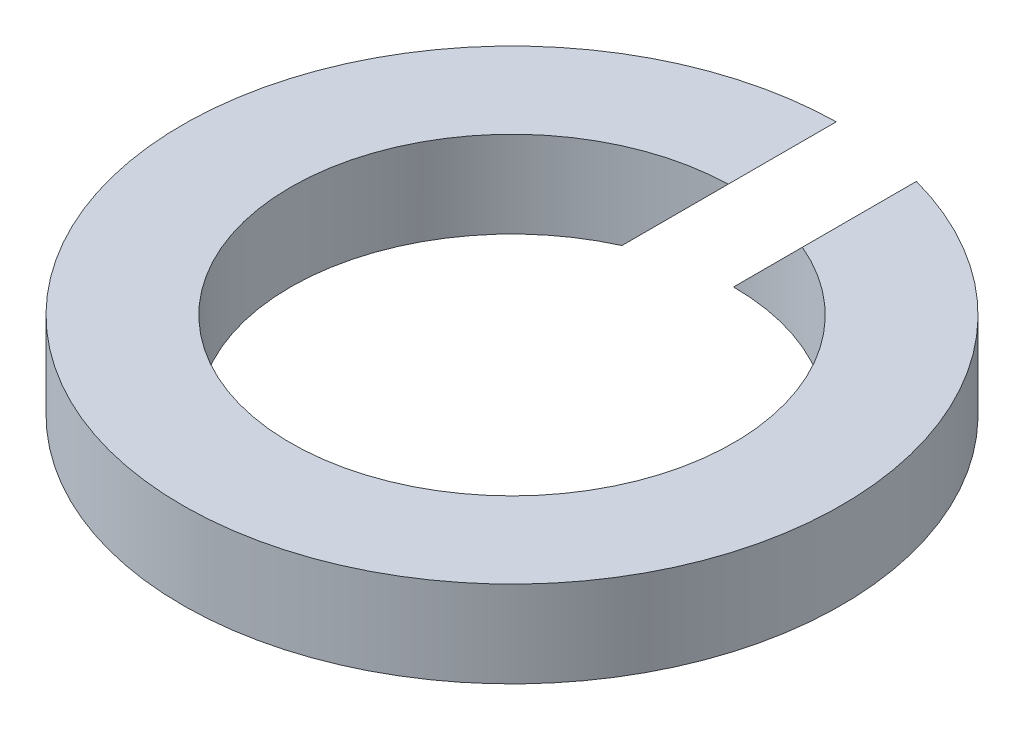
ISO-10303-21;
HEADER;
FILE_DESCRIPTION(('STEP AP214'),'2;1');
FILE_NAME('part.step','',(''),(''),'','','');
FILE_SCHEMA(('AUTOMOTIVE_DESIGN { 1 0 10303 214 1 1 1 1 }'));
ENDSEC;
DATA;
#1=APPLICATION_CONTEXT('core data for automotive mechanical design processes');
#2=APPLICATION_PROTOCOL_DEFINITION('international standard','automotive_design',2000,#1);
#3=PRODUCT_CONTEXT('',#1,'mechanical');
#4=PRODUCT('Part','Part','',(#3));
#5=PRODUCT_RELATED_PRODUCT_CATEGORY('part','',(#4));
#6=PRODUCT_DEFINITION_FORMATION('','',#4);
#7=PRODUCT_DEFINITION_CONTEXT('part definition',#1,'design');
#8=PRODUCT_DEFINITION('design','',#6,#7);
#9=PRODUCT_DEFINITION_SHAPE('','',#8);
#10=(LENGTH_UNIT() NAMED_UNIT(*) SI_UNIT(.MILLI.,.METRE.));
#11=(NAMED_UNIT(*) PLANE_ANGLE_UNIT() SI_UNIT($,.RADIAN.));
#12=(NAMED_UNIT(*) SI_UNIT($,.STERADIAN.) SOLID_ANGLE_UNIT());
#13=UNCERTAINTY_MEASURE_WITH_UNIT(LENGTH_MEASURE(1.E-05),#10,'distance_accuracy_value','');
#14=(GEOMETRIC_REPRESENTATION_CONTEXT(3) GLOBAL_UNCERTAINTY_ASSIGNED_CONTEXT((#13)) GLOBAL_UNIT_ASSIGNED_CONTEXT((#10,
#11,#12)) REPRESENTATION_CONTEXT('',''));
#15=CARTESIAN_POINT('',(0.,0.,0.));
#16=DIRECTION('',(0.,0.,1.));
#17=DIRECTION('',(1.,0.,0.));
#18=AXIS2_PLACEMENT_3D('',#15,#16,#17);
#19=CARTESIAN_POINT('',(0.,1.6,0.));
#20=DIRECTION('',(0.,1.,0.));
#21=DIRECTION('',(0.,0.,1.));
#22=AXIS2_PLACEMENT_3D('',#19,#20,#21);
#23=PLANE('',#22);
#24=DIRECTION('',(0.,0.,1.));
#25=VECTOR('',#24,1.);
#26=CARTESIAN_POINT('',(-0.0970562748477116,1.6,-6.1));
#27=LINE('',#26,#25);
#28=CARTESIAN_POINT('',(-0.0970562748477116,1.6,-6.09922782649678));
#29=VERTEX_POINT('',#28);
#30=CARTESIAN_POINT('',(-0.0970562748477116,1.6,-4.09885106822786));
#31=VERTEX_POINT('',#30);
#32=EDGE_CURVE('E60',#29,#31,#27,.T.);
#33=ORIENTED_EDGE('',*,*,#32,.F.);
#34=CARTESIAN_POINT('',(0.,1.6,0.));
#35=DIRECTION('',(0.,1.,0.));
#36=DIRECTION('',(0.,0.,1.));
#37=AXIS2_PLACEMENT_3D('',#34,#35,#36);
#38=CIRCLE('',#37,6.1);
#39=CARTESIAN_POINT('',(1.60000000000001,1.6,-5.88642506110457));
#40=VERTEX_POINT('',#39);
#41=EDGE_CURVE('E97',#29,#40,#38,.T.);
#42=ORIENTED_EDGE('',*,*,#41,.T.);
#43=DIRECTION('',(0.,0.,1.));
#44=VECTOR('',#43,1.);
#45=CARTESIAN_POINT('',(1.60000000000001,1.6,-6.1));
#46=LINE('',#45,#44);
#47=CARTESIAN_POINT('',(1.60000000000001,1.6,-3.77491721763537));
#48=VERTEX_POINT('',#47);
#49=EDGE_CURVE('E79',#40,#48,#46,.T.);
#50=ORIENTED_EDGE('',*,*,#49,.T.);
#51=CARTESIAN_POINT('',(0.,1.6,0.));
#52=DIRECTION('',(0.,1.,0.));
#53=DIRECTION('',(0.,0.,1.));
#54=AXIS2_PLACEMENT_3D('',#51,#52,#53);
#55=CIRCLE('',#54,4.1);
#56=EDGE_CURVE('E98',#31,#48,#55,.T.);
#57=ORIENTED_EDGE('',*,*,#56,.F.);
#58=EDGE_LOOP('',(#33,#42,#50,#57));
#59=FACE_BOUND('',#58,.T.);
#60=ADVANCED_FACE('F38',(#59),#23,.T.);
#61=CARTESIAN_POINT('',(0.,0.,0.));
#62=DIRECTION('',(0.,1.,0.));
#63=DIRECTION('',(0.,0.,1.));
#64=AXIS2_PLACEMENT_3D('',#61,#62,#63);
#65=PLANE('',#64);
#66=CARTESIAN_POINT('',(0.,0.,0.));
#67=DIRECTION('',(0.,1.,0.));
#68=DIRECTION('',(0.,0.,1.));
#69=AXIS2_PLACEMENT_3D('',#66,#67,#68);
#70=CIRCLE('',#69,6.1);
#71=CARTESIAN_POINT('',(-1.69705627484772,0.,-5.8591808301161));
#72=VERTEX_POINT('',#71);
#73=CARTESIAN_POINT('',(0.,0.,-6.1));
#74=VERTEX_POINT('',#73);
#75=EDGE_CURVE('E92',#72,#74,#70,.T.);
#76=ORIENTED_EDGE('',*,*,#75,.F.);
#77=DIRECTION('',(0.,0.,1.));
#78=VECTOR('',#77,1.);
#79=CARTESIAN_POINT('',(-1.69705627484772,0.,-6.1));
#80=LINE('',#79,#78);
#81=CARTESIAN_POINT('',(-1.69705627484772,0.,-3.7322915213043));
#82=VERTEX_POINT('',#81);
#83=EDGE_CURVE('E85',#72,#82,#80,.T.);
#84=ORIENTED_EDGE('',*,*,#83,.T.);
#85=CARTESIAN_POINT('',(0.,0.,0.));
#86=DIRECTION('',(0.,1.,0.));
#87=DIRECTION('',(0.,0.,1.));
#88=AXIS2_PLACEMENT_3D('',#85,#86,#87);
#89=CIRCLE('',#88,4.1);
#90=CARTESIAN_POINT('',(0.,0.,-4.1));
#91=VERTEX_POINT('',#90);
#92=EDGE_CURVE('E94',#82,#91,#89,.T.);
#93=ORIENTED_EDGE('',*,*,#92,.T.);
#94=DIRECTION('',(0.,0.,1.));
#95=VECTOR('',#94,1.);
#96=CARTESIAN_POINT('',(0.,0.,-6.1));
#97=LINE('',#96,#95);
#98=EDGE_CURVE('E53',#74,#91,#97,.T.);
#99=ORIENTED_EDGE('',*,*,#98,.F.);
#100=EDGE_LOOP('',(#76,#84,#93,#99));
#101=FACE_BOUND('',#100,.T.);
#102=ADVANCED_FACE('F90',(#101),#65,.F.);
#103=CARTESIAN_POINT('',(0.,1.6,0.));
#104=DIRECTION('',(0.,-1.,0.));
#105=DIRECTION('',(0.,0.,-1.));
#106=AXIS2_PLACEMENT_3D('',#103,#104,#105);
#107=CYLINDRICAL_SURFACE('',#106,6.1);
#108=ORIENTED_EDGE('',*,*,#41,.F.);
#109=CARTESIAN_POINT('',(0.,1.69705627484771,0.));
#110=DIRECTION('',(-0.707106781186546,0.707106781186549,0.));
#111=DIRECTION('',(-0.707106781186549,-0.707106781186546,0.));
#112=AXIS2_PLACEMENT_3D('',#109,#110,#111);
#113=ELLIPSE('',#112,8.62670273047586,6.1);
#114=EDGE_CURVE('E84',#29,#72,#113,.T.);
#115=ORIENTED_EDGE('',*,*,#114,.T.);
#116=ORIENTED_EDGE('',*,*,#75,.T.);
#117=CARTESIAN_POINT('',(0.,0.,0.));
#118=DIRECTION('',(0.707106781186546,-0.707106781186549,0.));
#119=DIRECTION('',(-0.707106781186549,-0.707106781186546,0.));
#120=AXIS2_PLACEMENT_3D('',#117,#118,#119);
#121=ELLIPSE('',#120,8.62670273047586,6.1);
#122=EDGE_CURVE('E76',#74,#40,#121,.T.);
#123=ORIENTED_EDGE('',*,*,#122,.T.);
#124=EDGE_LOOP('',(#108,#115,#116,#123));
#125=FACE_BOUND('',#124,.T.);
#126=ADVANCED_FACE('F40',(#125),#107,.T.);
#127=CARTESIAN_POINT('',(0.,1.6,0.));
#128=DIRECTION('',(0.,-1.,0.));
#129=DIRECTION('',(0.,0.,-1.));
#130=AXIS2_PLACEMENT_3D('',#127,#128,#129);
#131=CYLINDRICAL_SURFACE('',#130,4.1);
#132=CARTESIAN_POINT('',(0.,1.69705627484771,0.));
#133=DIRECTION('',(-0.707106781186546,0.707106781186549,0.));
#134=DIRECTION('',(-0.707106781186549,-0.707106781186546,0.));
#135=AXIS2_PLACEMENT_3D('',#132,#133,#134);
#136=ELLIPSE('',#135,5.79827560572968,4.1);
#137=EDGE_CURVE('E11',#31,#82,#136,.T.);
#138=ORIENTED_EDGE('',*,*,#137,.F.);
#139=ORIENTED_EDGE('',*,*,#56,.T.);
#140=CARTESIAN_POINT('',(0.,0.,0.));
#141=DIRECTION('',(0.707106781186546,-0.707106781186549,0.));
#142=DIRECTION('',(-0.707106781186549,-0.707106781186546,0.));
#143=AXIS2_PLACEMENT_3D('',#140,#141,#142);
#144=ELLIPSE('',#143,5.79827560572968,4.1);
#145=EDGE_CURVE('E46',#91,#48,#144,.T.);
#146=ORIENTED_EDGE('',*,*,#145,.F.);
#147=ORIENTED_EDGE('',*,*,#92,.F.);
#148=EDGE_LOOP('',(#138,#139,#146,#147));
#149=FACE_BOUND('',#148,.T.);
#150=ADVANCED_FACE('F108',(#149),#131,.F.);
#151=CARTESIAN_POINT('',(0.,0.,-6.1));
#152=DIRECTION('',(0.707106781186546,-0.707106781186549,0.));
#153=DIRECTION('',(0.707106781186549,0.707106781186546,0.));
#154=AXIS2_PLACEMENT_3D('',#151,#152,#153);
#155=PLANE('',#154);
#156=ORIENTED_EDGE('',*,*,#98,.T.);
#157=ORIENTED_EDGE('',*,*,#145,.T.);
#158=ORIENTED_EDGE('',*,*,#49,.F.);
#159=ORIENTED_EDGE('',*,*,#122,.F.);
#160=EDGE_LOOP('',(#156,#157,#158,#159));
#161=FACE_BOUND('',#160,.T.);
#162=ADVANCED_FACE('F77',(#161),#155,.F.);
#163=CARTESIAN_POINT('',(-0.0970562748477116,1.6,-6.1));
#164=DIRECTION('',(-0.707106781186546,0.707106781186549,0.));
#165=DIRECTION('',(-0.707106781186549,-0.707106781186546,0.));
#166=AXIS2_PLACEMENT_3D('',#163,#164,#165);
#167=PLANE('',#166);
#168=ORIENTED_EDGE('',*,*,#32,.T.);
#169=ORIENTED_EDGE('',*,*,#137,.T.);
#170=ORIENTED_EDGE('',*,*,#83,.F.);
#171=ORIENTED_EDGE('',*,*,#114,.F.);
#172=EDGE_LOOP('',(#168,#169,#170,#171));
#173=FACE_BOUND('',#172,.T.);
#174=ADVANCED_FACE('F109',(#173),#167,.F.);
#175=CLOSED_SHELL('',(#60,#102,#126,#150,#162,#174));
#176=MANIFOLD_SOLID_BREP('B2',#175);
#177=ADVANCED_BREP_SHAPE_REPRESENTATION('',(#18,#176),#14);
#178=SHAPE_DEFINITION_REPRESENTATION(#9,#177);
ENDSEC;
END-ISO-10303-21;
